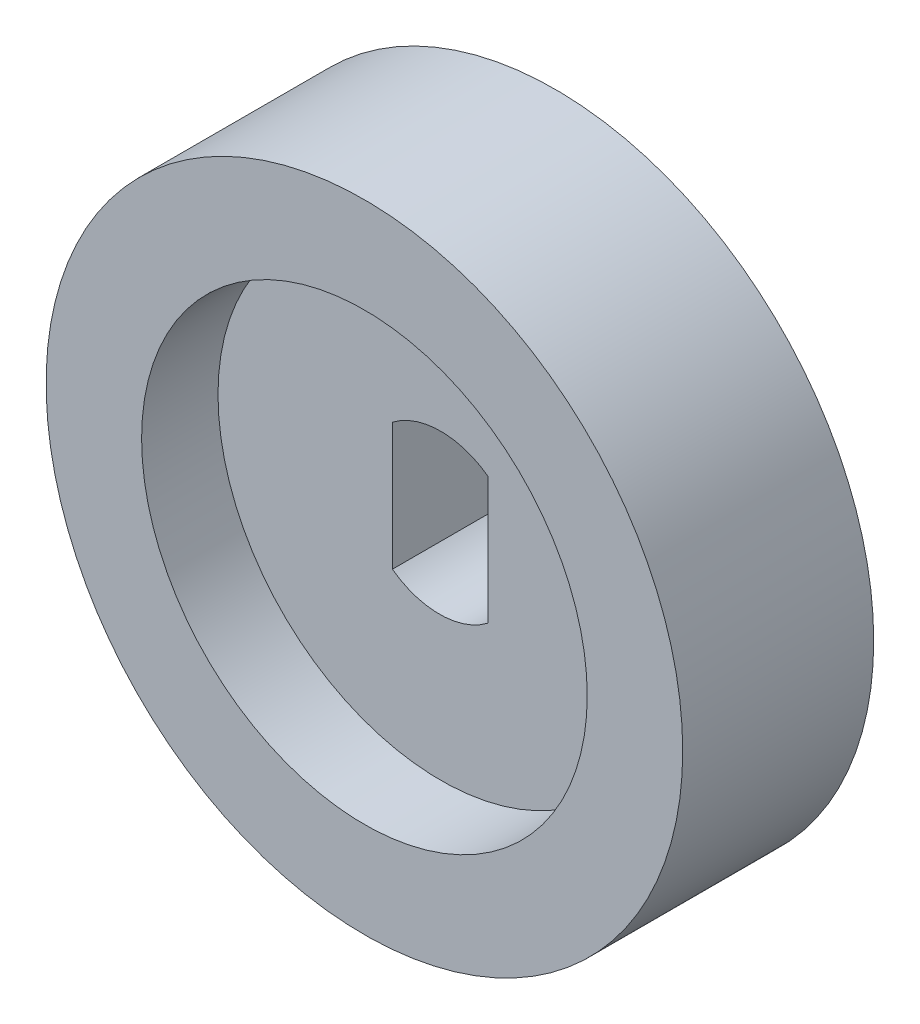
ISO-10303-21;
HEADER;
FILE_DESCRIPTION(('STEP AP214'),'2;1');
FILE_NAME('part.step','',(''),(''),'','','');
FILE_SCHEMA(('AUTOMOTIVE_DESIGN { 1 0 10303 214 1 1 1 1 }'));
ENDSEC;
DATA;
#1=APPLICATION_CONTEXT('core data for automotive mechanical design processes');
#2=APPLICATION_PROTOCOL_DEFINITION('international standard','automotive_design',2000,#1);
#3=PRODUCT_CONTEXT('',#1,'mechanical');
#4=PRODUCT('Part','Part','',(#3));
#5=PRODUCT_RELATED_PRODUCT_CATEGORY('part','',(#4));
#6=PRODUCT_DEFINITION_FORMATION('','',#4);
#7=PRODUCT_DEFINITION_CONTEXT('part definition',#1,'design');
#8=PRODUCT_DEFINITION('design','',#6,#7);
#9=PRODUCT_DEFINITION_SHAPE('','',#8);
#10=(LENGTH_UNIT() NAMED_UNIT(*) SI_UNIT(.MILLI.,.METRE.));
#11=(NAMED_UNIT(*) PLANE_ANGLE_UNIT() SI_UNIT($,.RADIAN.));
#12=(NAMED_UNIT(*) SI_UNIT($,.STERADIAN.) SOLID_ANGLE_UNIT());
#13=UNCERTAINTY_MEASURE_WITH_UNIT(LENGTH_MEASURE(1.E-05),#10,'distance_accuracy_value','');
#14=(GEOMETRIC_REPRESENTATION_CONTEXT(3) GLOBAL_UNCERTAINTY_ASSIGNED_CONTEXT((#13)) GLOBAL_UNIT_ASSIGNED_CONTEXT((#10,
#11,#12)) REPRESENTATION_CONTEXT('',''));
#15=CARTESIAN_POINT('',(0.,0.,0.));
#16=DIRECTION('',(0.,0.,1.));
#17=DIRECTION('',(1.,0.,0.));
#18=AXIS2_PLACEMENT_3D('',#15,#16,#17);
#19=CARTESIAN_POINT('',(-0.0433210245197385,-0.000234595775072503,3.));
#20=DIRECTION('',(0.,0.,-1.));
#21=DIRECTION('',(-1.,0.,0.));
#22=AXIS2_PLACEMENT_3D('',#19,#20,#21);
#23=CYLINDRICAL_SURFACE('',#22,2.5);
#24=DIRECTION('',(0.,0.,-1.));
#25=VECTOR('',#24,1.);
#26=CARTESIAN_POINT('',(-1.52157253884421,-2.01636268208244,3.));
#27=LINE('',#26,#25);
#28=CARTESIAN_POINT('',(-1.52157253884421,-2.01636268208244,0.6));
#29=VERTEX_POINT('',#28);
#30=CARTESIAN_POINT('',(-1.52157253884421,-2.01636268208244,-3.));
#31=VERTEX_POINT('',#30);
#32=EDGE_CURVE('E61',#29,#31,#27,.T.);
#33=ORIENTED_EDGE('',*,*,#32,.F.);
#34=CARTESIAN_POINT('',(-0.0433210245197385,-0.000234595775072503,0.6));
#35=DIRECTION('',(0.,0.,1.));
#36=DIRECTION('',(1.,0.,0.));
#37=AXIS2_PLACEMENT_3D('',#34,#35,#36);
#38=CIRCLE('',#37,2.5);
#39=CARTESIAN_POINT('',(1.47825151432448,-1.98387191369263,0.6));
#40=VERTEX_POINT('',#39);
#41=EDGE_CURVE('E55',#29,#40,#38,.T.);
#42=ORIENTED_EDGE('',*,*,#41,.T.);
#43=DIRECTION('',(0.,0.,-1.));
#44=VECTOR('',#43,1.);
#45=CARTESIAN_POINT('',(1.47825151432448,-1.98387191369263,3.));
#46=LINE('',#45,#44);
#47=CARTESIAN_POINT('',(1.47825151432448,-1.98387191369263,-3.));
#48=VERTEX_POINT('',#47);
#49=EDGE_CURVE('E102',#40,#48,#46,.T.);
#50=ORIENTED_EDGE('',*,*,#49,.T.);
#51=CARTESIAN_POINT('',(-0.0433210245197385,-0.000234595775072503,-3.));
#52=DIRECTION('',(0.,0.,1.));
#53=DIRECTION('',(1.,0.,0.));
#54=AXIS2_PLACEMENT_3D('',#51,#52,#53);
#55=CIRCLE('',#54,2.5);
#56=EDGE_CURVE('E123',#31,#48,#55,.T.);
#57=ORIENTED_EDGE('',*,*,#56,.F.);
#58=EDGE_LOOP('',(#33,#42,#50,#57));
#59=FACE_BOUND('',#58,.T.);
#60=ADVANCED_FACE('F39',(#59),#23,.F.);
#61=CARTESIAN_POINT('',(1.47825151432448,2.01612808630737,3.));
#62=DIRECTION('',(-1.,0.,0.));
#63=DIRECTION('',(0.,-1.,0.));
#64=AXIS2_PLACEMENT_3D('',#61,#62,#63);
#65=PLANE('',#64);
#66=ORIENTED_EDGE('',*,*,#49,.F.);
#67=DIRECTION('',(0.,1.,0.));
#68=VECTOR('',#67,1.);
#69=CARTESIAN_POINT('',(1.47825151432448,2.01612808630737,0.6));
#70=LINE('',#69,#68);
#71=CARTESIAN_POINT('',(1.47825151432448,2.01612808630737,0.6));
#72=VERTEX_POINT('',#71);
#73=EDGE_CURVE('E91',#40,#72,#70,.T.);
#74=ORIENTED_EDGE('',*,*,#73,.T.);
#75=DIRECTION('',(0.,0.,-1.));
#76=VECTOR('',#75,1.);
#77=CARTESIAN_POINT('',(1.47825151432448,2.01612808630737,3.));
#78=LINE('',#77,#76);
#79=CARTESIAN_POINT('',(1.47825151432448,2.01612808630737,-3.));
#80=VERTEX_POINT('',#79);
#81=EDGE_CURVE('E89',#72,#80,#78,.T.);
#82=ORIENTED_EDGE('',*,*,#81,.T.);
#83=DIRECTION('',(0.,1.,0.));
#84=VECTOR('',#83,1.);
#85=CARTESIAN_POINT('',(1.47825151432448,2.01612808630737,-3.));
#86=LINE('',#85,#84);
#87=EDGE_CURVE('E125',#48,#80,#86,.T.);
#88=ORIENTED_EDGE('',*,*,#87,.F.);
#89=EDGE_LOOP('',(#66,#74,#82,#88));
#90=FACE_BOUND('',#89,.T.);
#91=ADVANCED_FACE('F163',(#90),#65,.T.);
#92=CARTESIAN_POINT('',(0.,0.,3.));
#93=DIRECTION('',(0.,0.,-1.));
#94=DIRECTION('',(-1.,0.,0.));
#95=AXIS2_PLACEMENT_3D('',#92,#93,#94);
#96=CYLINDRICAL_SURFACE('',#95,2.5);
#97=ORIENTED_EDGE('',*,*,#81,.F.);
#98=CARTESIAN_POINT('',(0.,0.,0.6));
#99=DIRECTION('',(0.,0.,1.));
#100=DIRECTION('',(1.,0.,0.));
#101=AXIS2_PLACEMENT_3D('',#98,#99,#100);
#102=CIRCLE('',#101,2.5);
#103=CARTESIAN_POINT('',(-1.52157253884421,1.98363731791756,0.6));
#104=VERTEX_POINT('',#103);
#105=EDGE_CURVE('E81',#72,#104,#102,.T.);
#106=ORIENTED_EDGE('',*,*,#105,.T.);
#107=DIRECTION('',(0.,0.,-1.));
#108=VECTOR('',#107,1.);
#109=CARTESIAN_POINT('',(-1.52157253884421,1.98363731791756,3.));
#110=LINE('',#109,#108);
#111=CARTESIAN_POINT('',(-1.52157253884421,1.98363731791756,-3.));
#112=VERTEX_POINT('',#111);
#113=EDGE_CURVE('E88',#104,#112,#110,.T.);
#114=ORIENTED_EDGE('',*,*,#113,.T.);
#115=CARTESIAN_POINT('',(0.,0.,-3.));
#116=DIRECTION('',(0.,0.,1.));
#117=DIRECTION('',(-1.,0.,0.));
#118=AXIS2_PLACEMENT_3D('',#115,#116,#117);
#119=CIRCLE('',#118,2.5);
#120=EDGE_CURVE('E131',#80,#112,#119,.T.);
#121=ORIENTED_EDGE('',*,*,#120,.F.);
#122=EDGE_LOOP('',(#97,#106,#114,#121));
#123=FACE_BOUND('',#122,.T.);
#124=ADVANCED_FACE('F86',(#123),#96,.F.);
#125=CARTESIAN_POINT('',(-1.52157253884421,1.98363731791756,3.));
#126=DIRECTION('',(1.,0.,0.));
#127=DIRECTION('',(0.,1.,0.));
#128=AXIS2_PLACEMENT_3D('',#125,#126,#127);
#129=PLANE('',#128);
#130=ORIENTED_EDGE('',*,*,#113,.F.);
#131=DIRECTION('',(0.,-1.,0.));
#132=VECTOR('',#131,1.);
#133=CARTESIAN_POINT('',(-1.52157253884421,1.98363731791756,0.6));
#134=LINE('',#133,#132);
#135=EDGE_CURVE('E11',#104,#29,#134,.T.);
#136=ORIENTED_EDGE('',*,*,#135,.T.);
#137=ORIENTED_EDGE('',*,*,#32,.T.);
#138=DIRECTION('',(0.,-1.,0.));
#139=VECTOR('',#138,1.);
#140=CARTESIAN_POINT('',(-1.52157253884421,1.98363731791756,-3.));
#141=LINE('',#140,#139);
#142=EDGE_CURVE('E96',#112,#31,#141,.T.);
#143=ORIENTED_EDGE('',*,*,#142,.F.);
#144=EDGE_LOOP('',(#130,#136,#137,#143));
#145=FACE_BOUND('',#144,.T.);
#146=ADVANCED_FACE('F94',(#145),#129,.T.);
#147=CARTESIAN_POINT('',(0.,0.,3.));
#148=DIRECTION('',(0.,0.,1.));
#149=DIRECTION('',(1.,0.,0.));
#150=AXIS2_PLACEMENT_3D('',#147,#148,#149);
#151=PLANE('',#150);
#152=CARTESIAN_POINT('',(0.,0.,3.));
#153=DIRECTION('',(0.,0.,1.));
#154=DIRECTION('',(1.,0.,0.));
#155=AXIS2_PLACEMENT_3D('',#152,#153,#154);
#156=CIRCLE('',#155,7.);
#157=CARTESIAN_POINT('',(7.,0.,3.));
#158=VERTEX_POINT('',#157);
#159=EDGE_CURVE('E140',#158,#158,#156,.T.);
#160=ORIENTED_EDGE('',*,*,#159,.F.);
#161=EDGE_LOOP('',(#160));
#162=FACE_BOUND('',#161,.T.);
#163=CARTESIAN_POINT('',(0.,0.,3.));
#164=DIRECTION('',(0.,0.,1.));
#165=DIRECTION('',(1.,0.,0.));
#166=AXIS2_PLACEMENT_3D('',#163,#164,#165);
#167=CIRCLE('',#166,10.);
#168=CARTESIAN_POINT('',(10.,0.,3.));
#169=VERTEX_POINT('',#168);
#170=EDGE_CURVE('E48',#169,#169,#167,.T.);
#171=ORIENTED_EDGE('',*,*,#170,.T.);
#172=EDGE_LOOP('',(#171));
#173=FACE_BOUND('',#172,.T.);
#174=ADVANCED_FACE('F120',(#162,#173),#151,.T.);
#175=CARTESIAN_POINT('',(0.,0.,-3.));
#176=DIRECTION('',(0.,0.,1.));
#177=DIRECTION('',(1.,0.,0.));
#178=AXIS2_PLACEMENT_3D('',#175,#176,#177);
#179=PLANE('',#178);
#180=CARTESIAN_POINT('',(0.,0.,-3.));
#181=DIRECTION('',(0.,0.,1.));
#182=DIRECTION('',(1.,0.,0.));
#183=AXIS2_PLACEMENT_3D('',#180,#181,#182);
#184=CIRCLE('',#183,10.);
#185=CARTESIAN_POINT('',(10.,0.,-3.));
#186=VERTEX_POINT('',#185);
#187=EDGE_CURVE('E109',#186,#186,#184,.T.);
#188=ORIENTED_EDGE('',*,*,#187,.F.);
#189=EDGE_LOOP('',(#188));
#190=FACE_BOUND('',#189,.T.);
#191=ORIENTED_EDGE('',*,*,#56,.T.);
#192=ORIENTED_EDGE('',*,*,#87,.T.);
#193=ORIENTED_EDGE('',*,*,#120,.T.);
#194=ORIENTED_EDGE('',*,*,#142,.T.);
#195=EDGE_LOOP('',(#191,#192,#193,#194));
#196=FACE_BOUND('',#195,.T.);
#197=ADVANCED_FACE('F117',(#190,#196),#179,.F.);
#198=CARTESIAN_POINT('',(0.,0.,3.));
#199=DIRECTION('',(0.,0.,-1.));
#200=DIRECTION('',(-1.,0.,0.));
#201=AXIS2_PLACEMENT_3D('',#198,#199,#200);
#202=CYLINDRICAL_SURFACE('',#201,10.);
#203=ORIENTED_EDGE('',*,*,#170,.F.);
#204=EDGE_LOOP('',(#203));
#205=FACE_BOUND('',#204,.T.);
#206=ORIENTED_EDGE('',*,*,#187,.T.);
#207=EDGE_LOOP('',(#206));
#208=FACE_BOUND('',#207,.T.);
#209=ADVANCED_FACE('F41',(#205,#208),#202,.T.);
#210=CARTESIAN_POINT('',(0.,0.,0.6));
#211=DIRECTION('',(0.,0.,1.));
#212=DIRECTION('',(1.,0.,0.));
#213=AXIS2_PLACEMENT_3D('',#210,#211,#212);
#214=CYLINDRICAL_SURFACE('',#213,7.);
#215=CARTESIAN_POINT('',(0.,0.,0.6));
#216=DIRECTION('',(0.,0.,1.));
#217=DIRECTION('',(1.,0.,0.));
#218=AXIS2_PLACEMENT_3D('',#215,#216,#217);
#219=CIRCLE('',#218,7.);
#220=CARTESIAN_POINT('',(7.,0.,0.6));
#221=VERTEX_POINT('',#220);
#222=EDGE_CURVE('E92',#221,#221,#219,.T.);
#223=ORIENTED_EDGE('',*,*,#222,.F.);
#224=EDGE_LOOP('',(#223));
#225=FACE_BOUND('',#224,.T.);
#226=ORIENTED_EDGE('',*,*,#159,.T.);
#227=EDGE_LOOP('',(#226));
#228=FACE_BOUND('',#227,.T.);
#229=ADVANCED_FACE('F148',(#225,#228),#214,.F.);
#230=CARTESIAN_POINT('',(0.,0.,0.6));
#231=DIRECTION('',(0.,0.,1.));
#232=DIRECTION('',(1.,0.,0.));
#233=AXIS2_PLACEMENT_3D('',#230,#231,#232);
#234=PLANE('',#233);
#235=ORIENTED_EDGE('',*,*,#135,.F.);
#236=ORIENTED_EDGE('',*,*,#105,.F.);
#237=ORIENTED_EDGE('',*,*,#73,.F.);
#238=ORIENTED_EDGE('',*,*,#41,.F.);
#239=EDGE_LOOP('',(#235,#236,#237,#238));
#240=FACE_BOUND('',#239,.T.);
#241=ORIENTED_EDGE('',*,*,#222,.T.);
#242=EDGE_LOOP('',(#241));
#243=FACE_BOUND('',#242,.T.);
#244=ADVANCED_FACE('F79',(#240,#243),#234,.T.);
#245=CLOSED_SHELL('',(#60,#91,#124,#146,#174,#197,#209,#229,#244));
#246=MANIFOLD_SOLID_BREP('B2',#245);
#247=ADVANCED_BREP_SHAPE_REPRESENTATION('',(#18,#246),#14);
#248=SHAPE_DEFINITION_REPRESENTATION(#9,#247);
ENDSEC;
END-ISO-10303-21;
